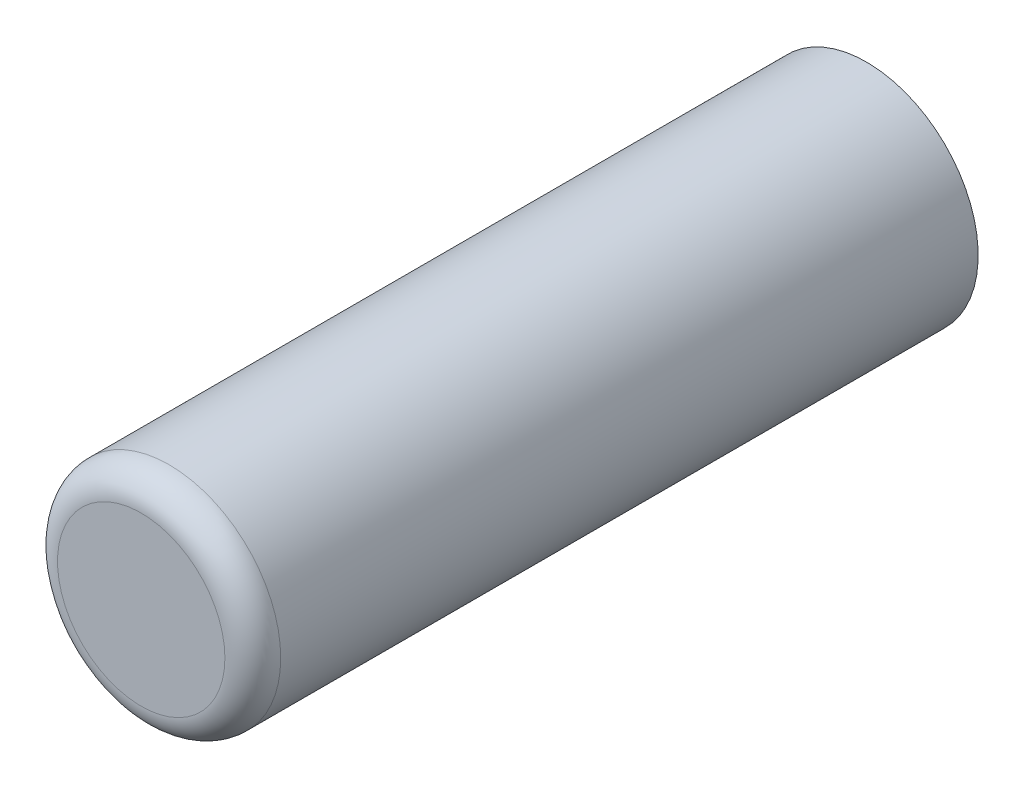
ISO-10303-21;
HEADER;
FILE_DESCRIPTION(('STEP AP214'),'2;1');
FILE_NAME('part.step','',(''),(''),'','','');
FILE_SCHEMA(('AUTOMOTIVE_DESIGN { 1 0 10303 214 1 1 1 1 }'));
ENDSEC;
DATA;
#1=APPLICATION_CONTEXT('core data for automotive mechanical design processes');
#2=APPLICATION_PROTOCOL_DEFINITION('international standard','automotive_design',2000,#1);
#3=PRODUCT_CONTEXT('',#1,'mechanical');
#4=PRODUCT('Part','Part','',(#3));
#5=PRODUCT_RELATED_PRODUCT_CATEGORY('part','',(#4));
#6=PRODUCT_DEFINITION_FORMATION('','',#4);
#7=PRODUCT_DEFINITION_CONTEXT('part definition',#1,'design');
#8=PRODUCT_DEFINITION('design','',#6,#7);
#9=PRODUCT_DEFINITION_SHAPE('','',#8);
#10=(LENGTH_UNIT() NAMED_UNIT(*) SI_UNIT(.MILLI.,.METRE.));
#11=(NAMED_UNIT(*) PLANE_ANGLE_UNIT() SI_UNIT($,.RADIAN.));
#12=(NAMED_UNIT(*) SI_UNIT($,.STERADIAN.) SOLID_ANGLE_UNIT());
#13=UNCERTAINTY_MEASURE_WITH_UNIT(LENGTH_MEASURE(1.E-05),#10,'distance_accuracy_value','');
#14=(GEOMETRIC_REPRESENTATION_CONTEXT(3) GLOBAL_UNCERTAINTY_ASSIGNED_CONTEXT((#13)) GLOBAL_UNIT_ASSIGNED_CONTEXT((#10,
#11,#12)) REPRESENTATION_CONTEXT('',''));
#15=CARTESIAN_POINT('',(0.,0.,0.));
#16=DIRECTION('',(0.,0.,1.));
#17=DIRECTION('',(1.,0.,0.));
#18=AXIS2_PLACEMENT_3D('',#15,#16,#17);
#19=CARTESIAN_POINT('',(0.,0.,13.));
#20=DIRECTION('',(0.,0.,-1.));
#21=DIRECTION('',(-1.,0.,0.));
#22=AXIS2_PLACEMENT_3D('',#19,#20,#21);
#23=CYLINDRICAL_SURFACE('',#22,2.);
#24=CARTESIAN_POINT('',(0.,0.,12.5));
#25=DIRECTION('',(0.,0.,1.));
#26=DIRECTION('',(1.,0.,0.));
#27=AXIS2_PLACEMENT_3D('',#24,#25,#26);
#28=CIRCLE('',#27,2.);
#29=CARTESIAN_POINT('',(-2.,0.,12.5));
#30=VERTEX_POINT('',#29);
#31=EDGE_CURVE('E10',#30,#30,#28,.F.);
#32=CARTESIAN_POINT('',(0.,0.,0.));
#33=DIRECTION('',(0.,0.,1.));
#34=DIRECTION('',(1.,0.,0.));
#35=AXIS2_PLACEMENT_3D('',#32,#33,#34);
#36=CIRCLE('',#35,2.);
#37=CARTESIAN_POINT('',(-2.,0.,0.));
#38=VERTEX_POINT('',#37);
#39=EDGE_CURVE('E45',#38,#38,#36,.T.);
#40=CARTESIAN_POINT('',(-2.,0.,12.5));
#41=CARTESIAN_POINT('',(-2.,0.,12.3697916666667));
#42=CARTESIAN_POINT('',(-2.,0.,12.2395833333333));
#43=CARTESIAN_POINT('',(-2.,0.,11.9791666666667));
#44=CARTESIAN_POINT('',(-2.,0.,11.8489583333333));
#45=CARTESIAN_POINT('',(-2.,0.,11.5885416666667));
#46=CARTESIAN_POINT('',(-2.,0.,11.4583333333333));
#47=CARTESIAN_POINT('',(-2.,0.,11.1979166666667));
#48=CARTESIAN_POINT('',(-2.,0.,11.0677083333333));
#49=CARTESIAN_POINT('',(-2.,0.,10.8072916666667));
#50=CARTESIAN_POINT('',(-2.,0.,10.6770833333333));
#51=CARTESIAN_POINT('',(-2.,0.,10.4166666666667));
#52=CARTESIAN_POINT('',(-2.,0.,10.2864583333333));
#53=CARTESIAN_POINT('',(-2.,0.,10.0260416666667));
#54=CARTESIAN_POINT('',(-2.,0.,9.89583333333333));
#55=CARTESIAN_POINT('',(-2.,0.,9.63541666666667));
#56=CARTESIAN_POINT('',(-2.,0.,9.50520833333333));
#57=CARTESIAN_POINT('',(-2.,0.,9.24479166666666));
#58=CARTESIAN_POINT('',(-2.,0.,9.11458333333333));
#59=CARTESIAN_POINT('',(-2.,0.,8.85416666666667));
#60=CARTESIAN_POINT('',(-2.,0.,8.72395833333333));
#61=CARTESIAN_POINT('',(-2.,0.,8.46354166666667));
#62=CARTESIAN_POINT('',(-2.,0.,8.33333333333333));
#63=CARTESIAN_POINT('',(-2.,0.,8.07291666666667));
#64=CARTESIAN_POINT('',(-2.,0.,7.94270833333333));
#65=CARTESIAN_POINT('',(-2.,0.,7.68229166666667));
#66=CARTESIAN_POINT('',(-2.,0.,7.55208333333333));
#67=CARTESIAN_POINT('',(-2.,0.,7.29166666666667));
#68=CARTESIAN_POINT('',(-2.,0.,7.16145833333333));
#69=CARTESIAN_POINT('',(-2.,0.,6.90104166666667));
#70=CARTESIAN_POINT('',(-2.,0.,6.77083333333333));
#71=CARTESIAN_POINT('',(-2.,0.,6.51041666666667));
#72=CARTESIAN_POINT('',(-2.,0.,6.38020833333333));
#73=CARTESIAN_POINT('',(-2.,0.,6.11979166666667));
#74=CARTESIAN_POINT('',(-2.,0.,5.98958333333333));
#75=CARTESIAN_POINT('',(-2.,0.,5.72916666666667));
#76=CARTESIAN_POINT('',(-2.,0.,5.59895833333333));
#77=CARTESIAN_POINT('',(-2.,0.,5.33854166666667));
#78=CARTESIAN_POINT('',(-2.,0.,5.20833333333333));
#79=CARTESIAN_POINT('',(-2.,0.,4.94791666666667));
#80=CARTESIAN_POINT('',(-2.,0.,4.81770833333333));
#81=CARTESIAN_POINT('',(-2.,0.,4.55729166666667));
#82=CARTESIAN_POINT('',(-2.,0.,4.42708333333333));
#83=CARTESIAN_POINT('',(-2.,0.,4.16666666666667));
#84=CARTESIAN_POINT('',(-2.,0.,4.03645833333333));
#85=CARTESIAN_POINT('',(-2.,0.,3.77604166666667));
#86=CARTESIAN_POINT('',(-2.,0.,3.64583333333333));
#87=CARTESIAN_POINT('',(-2.,0.,3.38541666666667));
#88=CARTESIAN_POINT('',(-2.,0.,3.25520833333333));
#89=CARTESIAN_POINT('',(-2.,0.,2.99479166666667));
#90=CARTESIAN_POINT('',(-2.,0.,2.86458333333333));
#91=CARTESIAN_POINT('',(-2.,0.,2.60416666666667));
#92=CARTESIAN_POINT('',(-2.,0.,2.47395833333333));
#93=CARTESIAN_POINT('',(-2.,0.,2.21354166666667));
#94=CARTESIAN_POINT('',(-2.,0.,2.08333333333333));
#95=CARTESIAN_POINT('',(-2.,0.,1.82291666666667));
#96=CARTESIAN_POINT('',(-2.,0.,1.69270833333333));
#97=CARTESIAN_POINT('',(-2.,0.,1.43229166666666));
#98=CARTESIAN_POINT('',(-2.,0.,1.30208333333333));
#99=CARTESIAN_POINT('',(-2.,0.,1.04166666666667));
#100=CARTESIAN_POINT('',(-2.,0.,0.911458333333334));
#101=CARTESIAN_POINT('',(-2.,0.,0.651041666666667));
#102=CARTESIAN_POINT('',(-2.,0.,0.520833333333333));
#103=CARTESIAN_POINT('',(-2.,0.,0.260416666666666));
#104=CARTESIAN_POINT('',(-2.,0.,0.130208333333333));
#105=CARTESIAN_POINT('',(-2.,0.,0.));
#106=B_SPLINE_CURVE_WITH_KNOTS('',3,(#40,#41,#42,#43,#44,#45,#46,#47,#48,#49,#50,#51,#52,#53,
#54,#55,#56,#57,#58,#59,#60,#61,#62,#63,#64,#65,#66,#67,#68,#69,#70,#71,#72,#73,#74,#75,#76,#77,
#78,#79,#80,#81,#82,#83,#84,#85,#86,#87,#88,#89,#90,#91,#92,#93,#94,#95,#96,#97,#98,#99,#100,
#101,#102,#103,#104,#105),.UNSPECIFIED.,.F.,.F.,(4,2,2,2,2,2,2,2,2,2,2,2,2,2,2,2,2,2,2,2,2,2,2,
2,2,2,2,2,2,2,2,2,4),(0.,0.390625,0.781250000000001,1.171875,1.5625,1.953125,2.34375,2.734375,
3.125,3.515625,3.90625,4.296875,4.6875,5.078125,5.46875,5.859375,6.25,6.640625,7.03125,7.421875,
7.8125,8.203125,8.59375,8.984375,9.375,9.765625,10.15625,10.546875,10.9375,11.328125,11.71875,
12.109375,12.5),.UNSPECIFIED.);
#107=EDGE_CURVE('BSEAM34',#30,#38,#106,.T.);
#108=ORIENTED_EDGE('',*,*,#31,.T.);
#109=ORIENTED_EDGE('',*,*,#39,.T.);
#110=ORIENTED_EDGE('',*,*,#107,.T.);
#111=ORIENTED_EDGE('',*,*,#107,.F.);
#112=EDGE_LOOP('',(#108,#110,#109,#111));
#113=FACE_BOUND('',#112,.T.);
#114=ADVANCED_FACE('F34',(#113),#23,.T.);
#115=CARTESIAN_POINT('',(0.,0.,13.));
#116=DIRECTION('',(0.,0.,1.));
#117=DIRECTION('',(1.,0.,0.));
#118=AXIS2_PLACEMENT_3D('',#115,#116,#117);
#119=PLANE('',#118);
#120=CARTESIAN_POINT('',(0.,0.,13.));
#121=DIRECTION('',(0.,0.,1.));
#122=DIRECTION('',(1.,0.,0.));
#123=AXIS2_PLACEMENT_3D('',#120,#121,#122);
#124=CIRCLE('',#123,1.5);
#125=CARTESIAN_POINT('',(1.5,0.,13.));
#126=VERTEX_POINT('',#125);
#127=EDGE_CURVE('E41',#126,#126,#124,.T.);
#128=ORIENTED_EDGE('',*,*,#127,.T.);
#129=EDGE_LOOP('',(#128));
#130=FACE_BOUND('',#129,.T.);
#131=ADVANCED_FACE('F55',(#130),#119,.T.);
#132=CARTESIAN_POINT('',(0.,0.,0.));
#133=DIRECTION('',(0.,0.,1.));
#134=DIRECTION('',(1.,0.,0.));
#135=AXIS2_PLACEMENT_3D('',#132,#133,#134);
#136=PLANE('',#135);
#137=ORIENTED_EDGE('',*,*,#39,.F.);
#138=EDGE_LOOP('',(#137));
#139=FACE_BOUND('',#138,.T.);
#140=ADVANCED_FACE('F53',(#139),#136,.F.);
#141=CARTESIAN_POINT('',(0.,0.,12.5));
#142=DIRECTION('',(0.,0.,1.));
#143=DIRECTION('',(1.,0.,0.));
#144=AXIS2_PLACEMENT_3D('',#141,#142,#143);
#145=TOROIDAL_SURFACE('',#144,1.5,0.5);
#146=ORIENTED_EDGE('',*,*,#31,.F.);
#147=EDGE_LOOP('',(#146));
#148=FACE_BOUND('',#147,.T.);
#149=ORIENTED_EDGE('',*,*,#127,.F.);
#150=EDGE_LOOP('',(#149));
#151=FACE_BOUND('',#150,.T.);
#152=ADVANCED_FACE('F36',(#148,#151),#145,.T.);
#153=CLOSED_SHELL('',(#114,#131,#140,#152));
#154=MANIFOLD_SOLID_BREP('B2',#153);
#155=ADVANCED_BREP_SHAPE_REPRESENTATION('',(#18,#154),#14);
#156=SHAPE_DEFINITION_REPRESENTATION(#9,#155);
ENDSEC;
END-ISO-10303-21;
